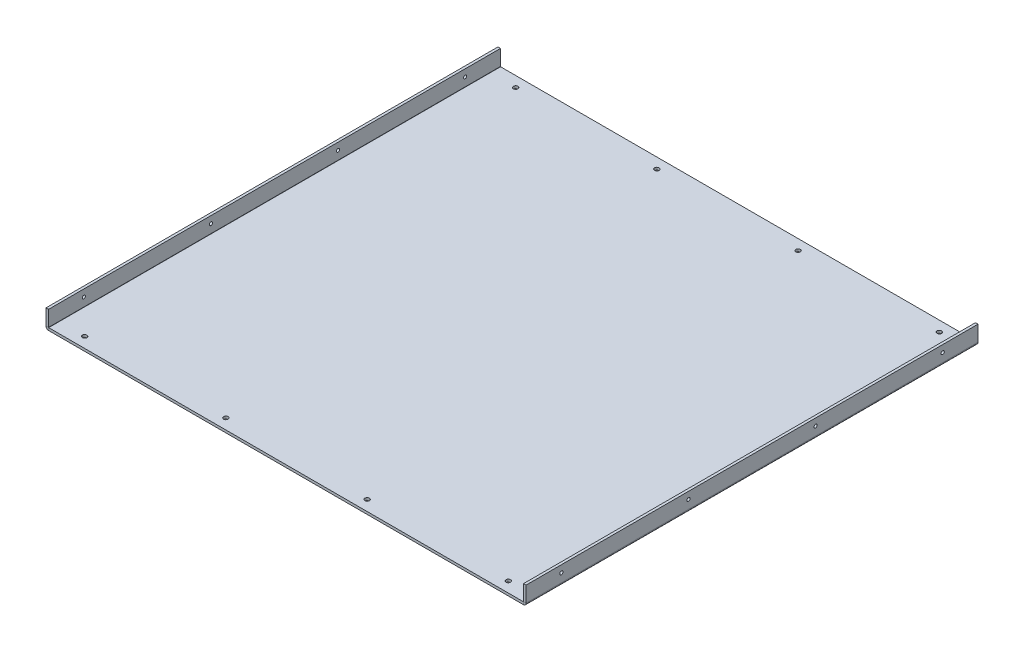
ISO-10303-21;
HEADER;
FILE_DESCRIPTION(('STEP AP214'),'2;1');
FILE_NAME('part.step','',(''),(''),'','','');
FILE_SCHEMA(('AUTOMOTIVE_DESIGN { 1 0 10303 214 1 1 1 1 }'));
ENDSEC;
DATA;
#1=APPLICATION_CONTEXT('core data for automotive mechanical design processes');
#2=APPLICATION_PROTOCOL_DEFINITION('international standard','automotive_design',2000,#1);
#3=PRODUCT_CONTEXT('',#1,'mechanical');
#4=PRODUCT('Part','Part','',(#3));
#5=PRODUCT_RELATED_PRODUCT_CATEGORY('part','',(#4));
#6=PRODUCT_DEFINITION_FORMATION('','',#4);
#7=PRODUCT_DEFINITION_CONTEXT('part definition',#1,'design');
#8=PRODUCT_DEFINITION('design','',#6,#7);
#9=PRODUCT_DEFINITION_SHAPE('','',#8);
#10=(LENGTH_UNIT() NAMED_UNIT(*) SI_UNIT(.MILLI.,.METRE.));
#11=(NAMED_UNIT(*) PLANE_ANGLE_UNIT() SI_UNIT($,.RADIAN.));
#12=(NAMED_UNIT(*) SI_UNIT($,.STERADIAN.) SOLID_ANGLE_UNIT());
#13=UNCERTAINTY_MEASURE_WITH_UNIT(LENGTH_MEASURE(1.E-05),#10,'distance_accuracy_value','');
#14=(GEOMETRIC_REPRESENTATION_CONTEXT(3) GLOBAL_UNCERTAINTY_ASSIGNED_CONTEXT((#13)) GLOBAL_UNIT_ASSIGNED_CONTEXT((#10,
#11,#12)) REPRESENTATION_CONTEXT('',''));
#15=CARTESIAN_POINT('',(0.,0.,0.));
#16=DIRECTION('',(0.,0.,1.));
#17=DIRECTION('',(1.,0.,0.));
#18=AXIS2_PLACEMENT_3D('',#15,#16,#17);
#19=CARTESIAN_POINT('',(0.,2.4384,406.4));
#20=DIRECTION('',(0.,0.,1.));
#21=DIRECTION('',(1.,0.,0.));
#22=AXIS2_PLACEMENT_3D('',#19,#20,#21);
#23=PLANE('',#22);
#24=DIRECTION('',(1.,0.,0.));
#25=VECTOR('',#24,1.);
#26=CARTESIAN_POINT('',(0.,2.4384,406.4));
#27=LINE('',#26,#25);
#28=CARTESIAN_POINT('',(0.,2.4384,406.4));
#29=VERTEX_POINT('',#28);
#30=CARTESIAN_POINT('',(2.286,2.4384,406.4));
#31=VERTEX_POINT('',#30);
#32=EDGE_CURVE('E11',#29,#31,#27,.T.);
#33=ORIENTED_EDGE('',*,*,#32,.F.);
#34=CARTESIAN_POINT('',(2.4384,2.4384,406.4));
#35=DIRECTION('',(0.,0.,-1.));
#36=DIRECTION('',(-1.,0.,0.));
#37=AXIS2_PLACEMENT_3D('',#34,#35,#36);
#38=CIRCLE('',#37,2.4384);
#39=CARTESIAN_POINT('',(2.4384,0.,406.4));
#40=VERTEX_POINT('',#39);
#41=EDGE_CURVE('E147',#29,#40,#38,.F.);
#42=ORIENTED_EDGE('',*,*,#41,.T.);
#43=DIRECTION('',(0.,-1.,0.));
#44=VECTOR('',#43,1.);
#45=CARTESIAN_POINT('',(2.4384,2.286,406.4));
#46=LINE('',#45,#44);
#47=CARTESIAN_POINT('',(2.4384,2.286,406.4));
#48=VERTEX_POINT('',#47);
#49=EDGE_CURVE('E45',#48,#40,#46,.T.);
#50=ORIENTED_EDGE('',*,*,#49,.F.);
#51=CARTESIAN_POINT('',(2.4384,2.4384,406.4));
#52=DIRECTION('',(0.,0.,1.));
#53=DIRECTION('',(1.,0.,0.));
#54=AXIS2_PLACEMENT_3D('',#51,#52,#53);
#55=CIRCLE('',#54,0.1524);
#56=EDGE_CURVE('E242',#31,#48,#55,.T.);
#57=ORIENTED_EDGE('',*,*,#56,.F.);
#58=EDGE_LOOP('',(#33,#42,#50,#57));
#59=FACE_BOUND('',#58,.T.);
#60=ADVANCED_FACE('F37',(#59),#23,.T.);
#61=CARTESIAN_POINT('',(2.4384,2.286,406.4));
#62=DIRECTION('',(0.,0.,1.));
#63=DIRECTION('',(1.,0.,0.));
#64=AXIS2_PLACEMENT_3D('',#61,#62,#63);
#65=PLANE('',#64);
#66=DIRECTION('',(0.,-1.,0.));
#67=VECTOR('',#66,1.);
#68=CARTESIAN_POINT('',(0.,0.,406.4));
#69=LINE('',#68,#67);
#70=CARTESIAN_POINT('',(0.,16.51,406.4));
#71=VERTEX_POINT('',#70);
#72=EDGE_CURVE('E152',#71,#29,#69,.T.);
#73=ORIENTED_EDGE('',*,*,#72,.T.);
#74=ORIENTED_EDGE('',*,*,#32,.T.);
#75=DIRECTION('',(0.,1.,0.));
#76=VECTOR('',#75,1.);
#77=CARTESIAN_POINT('',(2.286,0.,406.4));
#78=LINE('',#77,#76);
#79=CARTESIAN_POINT('',(2.286,16.51,406.4));
#80=VERTEX_POINT('',#79);
#81=EDGE_CURVE('E255',#80,#31,#78,.F.);
#82=ORIENTED_EDGE('',*,*,#81,.F.);
#83=DIRECTION('',(1.,0.,0.));
#84=VECTOR('',#83,1.);
#85=CARTESIAN_POINT('',(0.,16.51,406.4));
#86=LINE('',#85,#84);
#87=EDGE_CURVE('E257',#71,#80,#86,.T.);
#88=ORIENTED_EDGE('',*,*,#87,.F.);
#89=EDGE_LOOP('',(#73,#74,#82,#88));
#90=FACE_BOUND('',#89,.T.);
#91=ADVANCED_FACE('F268',(#90),#65,.T.);
#92=CARTESIAN_POINT('',(2.4384,0.,0.));
#93=DIRECTION('',(0.,0.,-1.));
#94=DIRECTION('',(-1.,0.,0.));
#95=AXIS2_PLACEMENT_3D('',#92,#93,#94);
#96=PLANE('',#95);
#97=DIRECTION('',(0.,1.,0.));
#98=VECTOR('',#97,1.);
#99=CARTESIAN_POINT('',(2.4384,0.,0.));
#100=LINE('',#99,#98);
#101=CARTESIAN_POINT('',(2.4384,0.,0.));
#102=VERTEX_POINT('',#101);
#103=CARTESIAN_POINT('',(2.4384,2.286,0.));
#104=VERTEX_POINT('',#103);
#105=EDGE_CURVE('E145',#102,#104,#100,.T.);
#106=ORIENTED_EDGE('',*,*,#105,.F.);
#107=CARTESIAN_POINT('',(2.4384,2.4384,0.));
#108=DIRECTION('',(0.,0.,-1.));
#109=DIRECTION('',(-1.,0.,0.));
#110=AXIS2_PLACEMENT_3D('',#107,#108,#109);
#111=CIRCLE('',#110,2.4384);
#112=CARTESIAN_POINT('',(0.,2.4384,0.));
#113=VERTEX_POINT('',#112);
#114=EDGE_CURVE('E159',#113,#102,#111,.F.);
#115=ORIENTED_EDGE('',*,*,#114,.F.);
#116=DIRECTION('',(-1.,0.,0.));
#117=VECTOR('',#116,1.);
#118=CARTESIAN_POINT('',(2.286,2.4384,0.));
#119=LINE('',#118,#117);
#120=CARTESIAN_POINT('',(2.286,2.4384,0.));
#121=VERTEX_POINT('',#120);
#122=EDGE_CURVE('E233',#121,#113,#119,.T.);
#123=ORIENTED_EDGE('',*,*,#122,.F.);
#124=CARTESIAN_POINT('',(2.4384,2.4384,0.));
#125=DIRECTION('',(0.,0.,1.));
#126=DIRECTION('',(1.,0.,0.));
#127=AXIS2_PLACEMENT_3D('',#124,#125,#126);
#128=CIRCLE('',#127,0.1524);
#129=EDGE_CURVE('E187',#121,#104,#128,.T.);
#130=ORIENTED_EDGE('',*,*,#129,.T.);
#131=EDGE_LOOP('',(#106,#115,#123,#130));
#132=FACE_BOUND('',#131,.T.);
#133=ADVANCED_FACE('F247',(#132),#96,.T.);
#134=CARTESIAN_POINT('',(2.286,2.4384,0.));
#135=DIRECTION('',(0.,0.,-1.));
#136=DIRECTION('',(-1.,0.,0.));
#137=AXIS2_PLACEMENT_3D('',#134,#135,#136);
#138=PLANE('',#137);
#139=DIRECTION('',(1.,0.,0.));
#140=VECTOR('',#139,1.);
#141=CARTESIAN_POINT('',(0.,0.,0.));
#142=LINE('',#141,#140);
#143=CARTESIAN_POINT('',(429.3616,0.,0.));
#144=VERTEX_POINT('',#143);
#145=EDGE_CURVE('E200',#102,#144,#142,.T.);
#146=ORIENTED_EDGE('',*,*,#145,.F.);
#147=ORIENTED_EDGE('',*,*,#105,.T.);
#148=DIRECTION('',(1.,0.,0.));
#149=VECTOR('',#148,1.);
#150=CARTESIAN_POINT('',(0.,2.286,0.));
#151=LINE('',#150,#149);
#152=CARTESIAN_POINT('',(429.3616,2.286,0.));
#153=VERTEX_POINT('',#152);
#154=EDGE_CURVE('E185',#104,#153,#151,.T.);
#155=ORIENTED_EDGE('',*,*,#154,.T.);
#156=DIRECTION('',(0.,-1.,0.));
#157=VECTOR('',#156,1.);
#158=CARTESIAN_POINT('',(429.3616,2.286,0.));
#159=LINE('',#158,#157);
#160=EDGE_CURVE('E94',#153,#144,#159,.T.);
#161=ORIENTED_EDGE('',*,*,#160,.T.);
#162=EDGE_LOOP('',(#146,#147,#155,#161));
#163=FACE_BOUND('',#162,.T.);
#164=ADVANCED_FACE('F235',(#163),#138,.T.);
#165=CARTESIAN_POINT('',(429.3616,0.,406.4));
#166=DIRECTION('',(0.,0.,1.));
#167=DIRECTION('',(1.,0.,0.));
#168=AXIS2_PLACEMENT_3D('',#165,#166,#167);
#169=PLANE('',#168);
#170=DIRECTION('',(0.,1.,0.));
#171=VECTOR('',#170,1.);
#172=CARTESIAN_POINT('',(429.3616,0.,406.4));
#173=LINE('',#172,#171);
#174=CARTESIAN_POINT('',(429.3616,0.,406.4));
#175=VERTEX_POINT('',#174);
#176=CARTESIAN_POINT('',(429.3616,2.286,406.4));
#177=VERTEX_POINT('',#176);
#178=EDGE_CURVE('E231',#175,#177,#173,.T.);
#179=ORIENTED_EDGE('',*,*,#178,.F.);
#180=CARTESIAN_POINT('',(429.3616,2.4384,406.4));
#181=DIRECTION('',(0.,0.,-1.));
#182=DIRECTION('',(-1.,0.,0.));
#183=AXIS2_PLACEMENT_3D('',#180,#181,#182);
#184=CIRCLE('',#183,2.4384);
#185=CARTESIAN_POINT('',(431.8,2.4384,406.4));
#186=VERTEX_POINT('',#185);
#187=EDGE_CURVE('E167',#175,#186,#184,.F.);
#188=ORIENTED_EDGE('',*,*,#187,.T.);
#189=DIRECTION('',(1.,0.,0.));
#190=VECTOR('',#189,1.);
#191=CARTESIAN_POINT('',(429.514,2.4384,406.4));
#192=LINE('',#191,#190);
#193=CARTESIAN_POINT('',(429.514,2.4384,406.4));
#194=VERTEX_POINT('',#193);
#195=EDGE_CURVE('E53',#194,#186,#192,.T.);
#196=ORIENTED_EDGE('',*,*,#195,.F.);
#197=CARTESIAN_POINT('',(429.3616,2.4384,406.4));
#198=DIRECTION('',(0.,0.,1.));
#199=DIRECTION('',(1.,0.,0.));
#200=AXIS2_PLACEMENT_3D('',#197,#198,#199);
#201=CIRCLE('',#200,0.1524);
#202=EDGE_CURVE('E259',#177,#194,#201,.T.);
#203=ORIENTED_EDGE('',*,*,#202,.F.);
#204=EDGE_LOOP('',(#179,#188,#196,#203));
#205=FACE_BOUND('',#204,.T.);
#206=ADVANCED_FACE('F296',(#205),#169,.T.);
#207=CARTESIAN_POINT('',(429.514,2.4384,406.4));
#208=DIRECTION('',(0.,0.,1.));
#209=DIRECTION('',(1.,0.,0.));
#210=AXIS2_PLACEMENT_3D('',#207,#208,#209);
#211=PLANE('',#210);
#212=DIRECTION('',(1.,0.,0.));
#213=VECTOR('',#212,1.);
#214=CARTESIAN_POINT('',(0.,0.,406.4));
#215=LINE('',#214,#213);
#216=EDGE_CURVE('E137',#40,#175,#215,.T.);
#217=ORIENTED_EDGE('',*,*,#216,.T.);
#218=ORIENTED_EDGE('',*,*,#178,.T.);
#219=DIRECTION('',(1.,0.,0.));
#220=VECTOR('',#219,1.);
#221=CARTESIAN_POINT('',(0.,2.286,406.4));
#222=LINE('',#221,#220);
#223=EDGE_CURVE('E140',#48,#177,#222,.T.);
#224=ORIENTED_EDGE('',*,*,#223,.F.);
#225=ORIENTED_EDGE('',*,*,#49,.T.);
#226=EDGE_LOOP('',(#217,#218,#224,#225));
#227=FACE_BOUND('',#226,.T.);
#228=ADVANCED_FACE('F135',(#227),#211,.T.);
#229=CARTESIAN_POINT('',(431.8,2.4384,0.));
#230=DIRECTION('',(0.,0.,-1.));
#231=DIRECTION('',(-1.,0.,0.));
#232=AXIS2_PLACEMENT_3D('',#229,#230,#231);
#233=PLANE('',#232);
#234=DIRECTION('',(-1.,0.,0.));
#235=VECTOR('',#234,1.);
#236=CARTESIAN_POINT('',(431.8,2.4384,0.));
#237=LINE('',#236,#235);
#238=CARTESIAN_POINT('',(431.8,2.4384,0.));
#239=VERTEX_POINT('',#238);
#240=CARTESIAN_POINT('',(429.514,2.4384,0.));
#241=VERTEX_POINT('',#240);
#242=EDGE_CURVE('E101',#239,#241,#237,.T.);
#243=ORIENTED_EDGE('',*,*,#242,.F.);
#244=CARTESIAN_POINT('',(429.3616,2.4384,0.));
#245=DIRECTION('',(0.,0.,-1.));
#246=DIRECTION('',(-1.,0.,0.));
#247=AXIS2_PLACEMENT_3D('',#244,#245,#246);
#248=CIRCLE('',#247,2.4384);
#249=EDGE_CURVE('E202',#144,#239,#248,.F.);
#250=ORIENTED_EDGE('',*,*,#249,.F.);
#251=ORIENTED_EDGE('',*,*,#160,.F.);
#252=CARTESIAN_POINT('',(429.3616,2.4384,0.));
#253=DIRECTION('',(0.,0.,1.));
#254=DIRECTION('',(1.,0.,0.));
#255=AXIS2_PLACEMENT_3D('',#252,#253,#254);
#256=CIRCLE('',#255,0.1524);
#257=EDGE_CURVE('E183',#153,#241,#256,.T.);
#258=ORIENTED_EDGE('',*,*,#257,.T.);
#259=EDGE_LOOP('',(#243,#250,#251,#258));
#260=FACE_BOUND('',#259,.T.);
#261=ADVANCED_FACE('F302',(#260),#233,.T.);
#262=CARTESIAN_POINT('',(429.3616,2.286,0.));
#263=DIRECTION('',(0.,0.,-1.));
#264=DIRECTION('',(-1.,0.,0.));
#265=AXIS2_PLACEMENT_3D('',#262,#263,#264);
#266=PLANE('',#265);
#267=DIRECTION('',(0.,1.,0.));
#268=VECTOR('',#267,1.);
#269=CARTESIAN_POINT('',(431.8,0.,0.));
#270=LINE('',#269,#268);
#271=CARTESIAN_POINT('',(431.8,16.51,0.));
#272=VERTEX_POINT('',#271);
#273=EDGE_CURVE('E173',#239,#272,#270,.T.);
#274=ORIENTED_EDGE('',*,*,#273,.F.);
#275=ORIENTED_EDGE('',*,*,#242,.T.);
#276=DIRECTION('',(0.,1.,0.));
#277=VECTOR('',#276,1.);
#278=CARTESIAN_POINT('',(429.514,0.,0.));
#279=LINE('',#278,#277);
#280=CARTESIAN_POINT('',(429.514,16.51,0.));
#281=VERTEX_POINT('',#280);
#282=EDGE_CURVE('E180',#241,#281,#279,.T.);
#283=ORIENTED_EDGE('',*,*,#282,.T.);
#284=DIRECTION('',(1.,0.,0.));
#285=VECTOR('',#284,1.);
#286=CARTESIAN_POINT('',(429.514,16.51,0.));
#287=LINE('',#286,#285);
#288=EDGE_CURVE('E176',#281,#272,#287,.T.);
#289=ORIENTED_EDGE('',*,*,#288,.T.);
#290=EDGE_LOOP('',(#274,#275,#283,#289));
#291=FACE_BOUND('',#290,.T.);
#292=ADVANCED_FACE('F305',(#291),#266,.T.);
#293=CARTESIAN_POINT('',(431.8,0.,406.4));
#294=DIRECTION('',(-1.,0.,0.));
#295=DIRECTION('',(0.,0.,1.));
#296=AXIS2_PLACEMENT_3D('',#293,#294,#295);
#297=PLANE('',#296);
#298=CARTESIAN_POINT('',(431.8,10.1599999999976,374.65));
#299=DIRECTION('',(1.,0.,0.));
#300=DIRECTION('',(0.,0.,-1.));
#301=AXIS2_PLACEMENT_3D('',#298,#299,#300);
#302=CIRCLE('',#301,1.4478);
#303=CARTESIAN_POINT('',(431.8,10.1599999999976,373.2022));
#304=VERTEX_POINT('',#303);
#305=EDGE_CURVE('E760',#304,#304,#302,.T.);
#306=ORIENTED_EDGE('',*,*,#305,.F.);
#307=EDGE_LOOP('',(#306));
#308=FACE_BOUND('',#307,.T.);
#309=CARTESIAN_POINT('',(431.8,10.1599999999984,260.35));
#310=DIRECTION('',(1.,0.,0.));
#311=DIRECTION('',(0.,0.,-1.));
#312=AXIS2_PLACEMENT_3D('',#309,#310,#311);
#313=CIRCLE('',#312,1.4478);
#314=CARTESIAN_POINT('',(431.8,10.1599999999984,258.9022));
#315=VERTEX_POINT('',#314);
#316=EDGE_CURVE('E748',#315,#315,#313,.T.);
#317=ORIENTED_EDGE('',*,*,#316,.F.);
#318=EDGE_LOOP('',(#317));
#319=FACE_BOUND('',#318,.T.);
#320=CARTESIAN_POINT('',(431.8,10.1599999999992,146.05));
#321=DIRECTION('',(1.,0.,0.));
#322=DIRECTION('',(0.,0.,-1.));
#323=AXIS2_PLACEMENT_3D('',#320,#321,#322);
#324=CIRCLE('',#323,1.4478);
#325=CARTESIAN_POINT('',(431.8,10.1599999999992,144.6022));
#326=VERTEX_POINT('',#325);
#327=EDGE_CURVE('E736',#326,#326,#324,.T.);
#328=ORIENTED_EDGE('',*,*,#327,.F.);
#329=EDGE_LOOP('',(#328));
#330=FACE_BOUND('',#329,.T.);
#331=CARTESIAN_POINT('',(431.8,10.16,31.75));
#332=DIRECTION('',(1.,0.,0.));
#333=DIRECTION('',(0.,0.,-1.));
#334=AXIS2_PLACEMENT_3D('',#331,#332,#333);
#335=CIRCLE('',#334,1.4478);
#336=CARTESIAN_POINT('',(431.8,10.16,30.3022));
#337=VERTEX_POINT('',#336);
#338=EDGE_CURVE('E724',#337,#337,#335,.T.);
#339=ORIENTED_EDGE('',*,*,#338,.F.);
#340=EDGE_LOOP('',(#339));
#341=FACE_BOUND('',#340,.T.);
#342=ORIENTED_EDGE('',*,*,#273,.T.);
#343=DIRECTION('',(0.,0.,-1.));
#344=VECTOR('',#343,1.);
#345=CARTESIAN_POINT('',(431.8,16.51,406.4));
#346=LINE('',#345,#344);
#347=CARTESIAN_POINT('',(431.8,16.51,406.4));
#348=VERTEX_POINT('',#347);
#349=EDGE_CURVE('E226',#348,#272,#346,.T.);
#350=ORIENTED_EDGE('',*,*,#349,.F.);
#351=DIRECTION('',(0.,1.,0.));
#352=VECTOR('',#351,1.);
#353=CARTESIAN_POINT('',(431.8,0.,406.4));
#354=LINE('',#353,#352);
#355=EDGE_CURVE('E107',#186,#348,#354,.T.);
#356=ORIENTED_EDGE('',*,*,#355,.F.);
#357=DIRECTION('',(0.,0.,-1.));
#358=VECTOR('',#357,1.);
#359=CARTESIAN_POINT('',(431.8,2.4384,406.4));
#360=LINE('',#359,#358);
#361=EDGE_CURVE('E169',#186,#239,#360,.T.);
#362=ORIENTED_EDGE('',*,*,#361,.T.);
#363=EDGE_LOOP('',(#342,#350,#356,#362));
#364=FACE_BOUND('',#363,.T.);
#365=ADVANCED_FACE('F308',(#308,#319,#330,#341,#364),#297,.F.);
#366=CARTESIAN_POINT('',(429.514,16.51,406.4));
#367=DIRECTION('',(0.,1.,0.));
#368=DIRECTION('',(0.,0.,1.));
#369=AXIS2_PLACEMENT_3D('',#366,#367,#368);
#370=PLANE('',#369);
#371=ORIENTED_EDGE('',*,*,#288,.F.);
#372=DIRECTION('',(0.,0.,-1.));
#373=VECTOR('',#372,1.);
#374=CARTESIAN_POINT('',(429.514,16.51,406.4));
#375=LINE('',#374,#373);
#376=CARTESIAN_POINT('',(429.514,16.51,406.4));
#377=VERTEX_POINT('',#376);
#378=EDGE_CURVE('E224',#377,#281,#375,.T.);
#379=ORIENTED_EDGE('',*,*,#378,.F.);
#380=DIRECTION('',(1.,0.,0.));
#381=VECTOR('',#380,1.);
#382=CARTESIAN_POINT('',(429.514,16.51,406.4));
#383=LINE('',#382,#381);
#384=EDGE_CURVE('E707',#377,#348,#383,.T.);
#385=ORIENTED_EDGE('',*,*,#384,.T.);
#386=ORIENTED_EDGE('',*,*,#349,.T.);
#387=EDGE_LOOP('',(#371,#379,#385,#386));
#388=FACE_BOUND('',#387,.T.);
#389=ADVANCED_FACE('F312',(#388),#370,.T.);
#390=CARTESIAN_POINT('',(429.514,0.,406.4));
#391=DIRECTION('',(-1.,0.,0.));
#392=DIRECTION('',(0.,0.,1.));
#393=AXIS2_PLACEMENT_3D('',#390,#391,#392);
#394=PLANE('',#393);
#395=CARTESIAN_POINT('',(429.514,10.1599999999976,374.65));
#396=DIRECTION('',(-1.,0.,0.));
#397=DIRECTION('',(0.,0.,1.));
#398=AXIS2_PLACEMENT_3D('',#395,#396,#397);
#399=CIRCLE('',#398,1.4478);
#400=CARTESIAN_POINT('',(429.514,10.1599999999976,376.0978));
#401=VERTEX_POINT('',#400);
#402=EDGE_CURVE('E751',#401,#401,#399,.T.);
#403=ORIENTED_EDGE('',*,*,#402,.F.);
#404=EDGE_LOOP('',(#403));
#405=FACE_BOUND('',#404,.T.);
#406=CARTESIAN_POINT('',(429.514,10.1599999999984,260.35));
#407=DIRECTION('',(-1.,0.,0.));
#408=DIRECTION('',(0.,0.,1.));
#409=AXIS2_PLACEMENT_3D('',#406,#407,#408);
#410=CIRCLE('',#409,1.4478);
#411=CARTESIAN_POINT('',(429.514,10.1599999999984,261.7978));
#412=VERTEX_POINT('',#411);
#413=EDGE_CURVE('E739',#412,#412,#410,.T.);
#414=ORIENTED_EDGE('',*,*,#413,.F.);
#415=EDGE_LOOP('',(#414));
#416=FACE_BOUND('',#415,.T.);
#417=CARTESIAN_POINT('',(429.514,10.1599999999992,146.05));
#418=DIRECTION('',(-1.,0.,0.));
#419=DIRECTION('',(0.,0.,1.));
#420=AXIS2_PLACEMENT_3D('',#417,#418,#419);
#421=CIRCLE('',#420,1.4478);
#422=CARTESIAN_POINT('',(429.514,10.1599999999992,147.4978));
#423=VERTEX_POINT('',#422);
#424=EDGE_CURVE('E727',#423,#423,#421,.T.);
#425=ORIENTED_EDGE('',*,*,#424,.F.);
#426=EDGE_LOOP('',(#425));
#427=FACE_BOUND('',#426,.T.);
#428=CARTESIAN_POINT('',(429.514,10.16,31.75));
#429=DIRECTION('',(-1.,0.,0.));
#430=DIRECTION('',(0.,0.,1.));
#431=AXIS2_PLACEMENT_3D('',#428,#429,#430);
#432=CIRCLE('',#431,1.4478);
#433=CARTESIAN_POINT('',(429.514,10.16,33.1978));
#434=VERTEX_POINT('',#433);
#435=EDGE_CURVE('E177',#434,#434,#432,.T.);
#436=ORIENTED_EDGE('',*,*,#435,.F.);
#437=EDGE_LOOP('',(#436));
#438=FACE_BOUND('',#437,.T.);
#439=ORIENTED_EDGE('',*,*,#282,.F.);
#440=DIRECTION('',(0.,0.,-1.));
#441=VECTOR('',#440,1.);
#442=CARTESIAN_POINT('',(429.514,2.4384,406.4));
#443=LINE('',#442,#441);
#444=EDGE_CURVE('E221',#194,#241,#443,.T.);
#445=ORIENTED_EDGE('',*,*,#444,.F.);
#446=DIRECTION('',(0.,1.,0.));
#447=VECTOR('',#446,1.);
#448=CARTESIAN_POINT('',(429.514,0.,406.4));
#449=LINE('',#448,#447);
#450=EDGE_CURVE('E709',#194,#377,#449,.T.);
#451=ORIENTED_EDGE('',*,*,#450,.T.);
#452=ORIENTED_EDGE('',*,*,#378,.T.);
#453=EDGE_LOOP('',(#439,#445,#451,#452));
#454=FACE_BOUND('',#453,.T.);
#455=ADVANCED_FACE('F316',(#405,#416,#427,#438,#454),#394,.T.);
#456=CARTESIAN_POINT('',(429.3616,2.4384,406.4));
#457=DIRECTION('',(0.,0.,-1.));
#458=DIRECTION('',(-1.,0.,0.));
#459=AXIS2_PLACEMENT_3D('',#456,#457,#458);
#460=CYLINDRICAL_SURFACE('',#459,0.1524);
#461=ORIENTED_EDGE('',*,*,#257,.F.);
#462=DIRECTION('',(0.,0.,-1.));
#463=VECTOR('',#462,1.);
#464=CARTESIAN_POINT('',(429.3616,2.286,406.4));
#465=LINE('',#464,#463);
#466=EDGE_CURVE('E218',#177,#153,#465,.T.);
#467=ORIENTED_EDGE('',*,*,#466,.F.);
#468=ORIENTED_EDGE('',*,*,#202,.T.);
#469=ORIENTED_EDGE('',*,*,#444,.T.);
#470=EDGE_LOOP('',(#461,#467,#468,#469));
#471=FACE_BOUND('',#470,.T.);
#472=ADVANCED_FACE('F320',(#471),#460,.F.);
#473=CARTESIAN_POINT('',(0.,2.286,406.4));
#474=DIRECTION('',(0.,1.,0.));
#475=DIRECTION('',(0.,0.,1.));
#476=AXIS2_PLACEMENT_3D('',#473,#474,#475);
#477=PLANE('',#476);
#478=CARTESIAN_POINT('',(25.3999999999959,2.286,9.39799999999996));
#479=DIRECTION('',(0.,1.,0.));
#480=DIRECTION('',(0.,0.,1.));
#481=AXIS2_PLACEMENT_3D('',#478,#479,#480);
#482=CIRCLE('',#481,2.03199999999993);
#483=CARTESIAN_POINT('',(25.3999999999959,2.286,11.4299999999999));
#484=VERTEX_POINT('',#483);
#485=EDGE_CURVE('E808',#484,#484,#482,.T.);
#486=ORIENTED_EDGE('',*,*,#485,.F.);
#487=EDGE_LOOP('',(#486));
#488=FACE_BOUND('',#487,.T.);
#489=CARTESIAN_POINT('',(152.399999999996,2.286,9.39799999999996));
#490=DIRECTION('',(0.,1.,0.));
#491=DIRECTION('',(0.,0.,1.));
#492=AXIS2_PLACEMENT_3D('',#489,#490,#491);
#493=CIRCLE('',#492,2.03199999999995);
#494=CARTESIAN_POINT('',(152.399999999996,2.286,11.4299999999999));
#495=VERTEX_POINT('',#494);
#496=EDGE_CURVE('E802',#495,#495,#493,.T.);
#497=ORIENTED_EDGE('',*,*,#496,.F.);
#498=EDGE_LOOP('',(#497));
#499=FACE_BOUND('',#498,.T.);
#500=CARTESIAN_POINT('',(279.399999999996,2.286,9.39799999999996));
#501=DIRECTION('',(0.,1.,0.));
#502=DIRECTION('',(0.,0.,1.));
#503=AXIS2_PLACEMENT_3D('',#500,#501,#502);
#504=CIRCLE('',#503,2.03199999999995);
#505=CARTESIAN_POINT('',(279.399999999996,2.286,11.4299999999999));
#506=VERTEX_POINT('',#505);
#507=EDGE_CURVE('E796',#506,#506,#504,.T.);
#508=ORIENTED_EDGE('',*,*,#507,.F.);
#509=EDGE_LOOP('',(#508));
#510=FACE_BOUND('',#509,.T.);
#511=CARTESIAN_POINT('',(406.399999999996,2.286,9.39799999999996));
#512=DIRECTION('',(0.,1.,0.));
#513=DIRECTION('',(0.,0.,1.));
#514=AXIS2_PLACEMENT_3D('',#511,#512,#513);
#515=CIRCLE('',#514,2.03199999999995);
#516=CARTESIAN_POINT('',(406.399999999996,2.286,11.4299999999999));
#517=VERTEX_POINT('',#516);
#518=EDGE_CURVE('E790',#517,#517,#515,.T.);
#519=ORIENTED_EDGE('',*,*,#518,.F.);
#520=EDGE_LOOP('',(#519));
#521=FACE_BOUND('',#520,.T.);
#522=CARTESIAN_POINT('',(25.4,2.286,397.002));
#523=DIRECTION('',(0.,1.,0.));
#524=DIRECTION('',(0.,0.,1.));
#525=AXIS2_PLACEMENT_3D('',#522,#523,#524);
#526=CIRCLE('',#525,2.03199999999992);
#527=CARTESIAN_POINT('',(25.4,2.286,399.034));
#528=VERTEX_POINT('',#527);
#529=EDGE_CURVE('E784',#528,#528,#526,.T.);
#530=ORIENTED_EDGE('',*,*,#529,.F.);
#531=EDGE_LOOP('',(#530));
#532=FACE_BOUND('',#531,.T.);
#533=CARTESIAN_POINT('',(152.4,2.286,397.002));
#534=DIRECTION('',(0.,1.,0.));
#535=DIRECTION('',(0.,0.,1.));
#536=AXIS2_PLACEMENT_3D('',#533,#534,#535);
#537=CIRCLE('',#536,2.03199999999994);
#538=CARTESIAN_POINT('',(152.4,2.286,399.034));
#539=VERTEX_POINT('',#538);
#540=EDGE_CURVE('E778',#539,#539,#537,.T.);
#541=ORIENTED_EDGE('',*,*,#540,.F.);
#542=EDGE_LOOP('',(#541));
#543=FACE_BOUND('',#542,.T.);
#544=CARTESIAN_POINT('',(279.4,2.286,397.002));
#545=DIRECTION('',(0.,1.,0.));
#546=DIRECTION('',(0.,0.,1.));
#547=AXIS2_PLACEMENT_3D('',#544,#545,#546);
#548=CIRCLE('',#547,2.03199999999994);
#549=CARTESIAN_POINT('',(279.4,2.286,399.034));
#550=VERTEX_POINT('',#549);
#551=EDGE_CURVE('E772',#550,#550,#548,.T.);
#552=ORIENTED_EDGE('',*,*,#551,.F.);
#553=EDGE_LOOP('',(#552));
#554=FACE_BOUND('',#553,.T.);
#555=CARTESIAN_POINT('',(406.4,2.286,397.002));
#556=DIRECTION('',(0.,1.,0.));
#557=DIRECTION('',(0.,0.,1.));
#558=AXIS2_PLACEMENT_3D('',#555,#556,#557);
#559=CIRCLE('',#558,2.03199999999994);
#560=CARTESIAN_POINT('',(406.4,2.286,399.034));
#561=VERTEX_POINT('',#560);
#562=EDGE_CURVE('E766',#561,#561,#559,.T.);
#563=ORIENTED_EDGE('',*,*,#562,.F.);
#564=EDGE_LOOP('',(#563));
#565=FACE_BOUND('',#564,.T.);
#566=ORIENTED_EDGE('',*,*,#154,.F.);
#567=DIRECTION('',(0.,0.,-1.));
#568=VECTOR('',#567,1.);
#569=CARTESIAN_POINT('',(2.4384,2.286,406.4));
#570=LINE('',#569,#568);
#571=EDGE_CURVE('E215',#48,#104,#570,.T.);
#572=ORIENTED_EDGE('',*,*,#571,.F.);
#573=ORIENTED_EDGE('',*,*,#223,.T.);
#574=ORIENTED_EDGE('',*,*,#466,.T.);
#575=EDGE_LOOP('',(#566,#572,#573,#574));
#576=FACE_BOUND('',#575,.T.);
#577=ADVANCED_FACE('F244',(#488,#499,#510,#521,#532,#543,#554,#565,#576),#477,.T.);
#578=CARTESIAN_POINT('',(2.4384,2.4384,406.4));
#579=DIRECTION('',(0.,0.,-1.));
#580=DIRECTION('',(-1.,0.,0.));
#581=AXIS2_PLACEMENT_3D('',#578,#579,#580);
#582=CYLINDRICAL_SURFACE('',#581,0.1524);
#583=ORIENTED_EDGE('',*,*,#129,.F.);
#584=DIRECTION('',(0.,0.,-1.));
#585=VECTOR('',#584,1.);
#586=CARTESIAN_POINT('',(2.286,2.4384,406.4));
#587=LINE('',#586,#585);
#588=EDGE_CURVE('E212',#31,#121,#587,.T.);
#589=ORIENTED_EDGE('',*,*,#588,.F.);
#590=ORIENTED_EDGE('',*,*,#56,.T.);
#591=ORIENTED_EDGE('',*,*,#571,.T.);
#592=EDGE_LOOP('',(#583,#589,#590,#591));
#593=FACE_BOUND('',#592,.T.);
#594=ADVANCED_FACE('F240',(#593),#582,.F.);
#595=CARTESIAN_POINT('',(2.286,0.,406.4));
#596=DIRECTION('',(1.,0.,0.));
#597=DIRECTION('',(0.,0.,-1.));
#598=AXIS2_PLACEMENT_3D('',#595,#596,#597);
#599=PLANE('',#598);
#600=CARTESIAN_POINT('',(2.286,10.1599999999976,374.65));
#601=DIRECTION('',(1.,0.,0.));
#602=DIRECTION('',(0.,0.,-1.));
#603=AXIS2_PLACEMENT_3D('',#600,#601,#602);
#604=CIRCLE('',#603,1.4478);
#605=CARTESIAN_POINT('',(2.286,10.1599999999976,373.2022));
#606=VERTEX_POINT('',#605);
#607=EDGE_CURVE('E756',#606,#606,#604,.T.);
#608=ORIENTED_EDGE('',*,*,#607,.F.);
#609=EDGE_LOOP('',(#608));
#610=FACE_BOUND('',#609,.T.);
#611=CARTESIAN_POINT('',(2.286,10.1599999999984,260.35));
#612=DIRECTION('',(1.,0.,0.));
#613=DIRECTION('',(0.,0.,-1.));
#614=AXIS2_PLACEMENT_3D('',#611,#612,#613);
#615=CIRCLE('',#614,1.4478);
#616=CARTESIAN_POINT('',(2.286,10.1599999999984,258.9022));
#617=VERTEX_POINT('',#616);
#618=EDGE_CURVE('E744',#617,#617,#615,.T.);
#619=ORIENTED_EDGE('',*,*,#618,.F.);
#620=EDGE_LOOP('',(#619));
#621=FACE_BOUND('',#620,.T.);
#622=CARTESIAN_POINT('',(2.286,10.1599999999992,146.05));
#623=DIRECTION('',(1.,0.,0.));
#624=DIRECTION('',(0.,0.,-1.));
#625=AXIS2_PLACEMENT_3D('',#622,#623,#624);
#626=CIRCLE('',#625,1.4478);
#627=CARTESIAN_POINT('',(2.286,10.1599999999992,144.6022));
#628=VERTEX_POINT('',#627);
#629=EDGE_CURVE('E732',#628,#628,#626,.T.);
#630=ORIENTED_EDGE('',*,*,#629,.F.);
#631=EDGE_LOOP('',(#630));
#632=FACE_BOUND('',#631,.T.);
#633=CARTESIAN_POINT('',(2.286,10.16,31.75));
#634=DIRECTION('',(1.,0.,0.));
#635=DIRECTION('',(0.,0.,-1.));
#636=AXIS2_PLACEMENT_3D('',#633,#634,#635);
#637=CIRCLE('',#636,1.4478);
#638=CARTESIAN_POINT('',(2.286,10.16,30.3022));
#639=VERTEX_POINT('',#638);
#640=EDGE_CURVE('E720',#639,#639,#637,.T.);
#641=ORIENTED_EDGE('',*,*,#640,.F.);
#642=EDGE_LOOP('',(#641));
#643=FACE_BOUND('',#642,.T.);
#644=DIRECTION('',(0.,1.,0.));
#645=VECTOR('',#644,1.);
#646=CARTESIAN_POINT('',(2.286,0.,0.));
#647=LINE('',#646,#645);
#648=CARTESIAN_POINT('',(2.286,16.51,0.));
#649=VERTEX_POINT('',#648);
#650=EDGE_CURVE('E190',#649,#121,#647,.F.);
#651=ORIENTED_EDGE('',*,*,#650,.F.);
#652=DIRECTION('',(0.,0.,-1.));
#653=VECTOR('',#652,1.);
#654=CARTESIAN_POINT('',(2.286,16.51,406.4));
#655=LINE('',#654,#653);
#656=EDGE_CURVE('E210',#80,#649,#655,.T.);
#657=ORIENTED_EDGE('',*,*,#656,.F.);
#658=ORIENTED_EDGE('',*,*,#81,.T.);
#659=ORIENTED_EDGE('',*,*,#588,.T.);
#660=EDGE_LOOP('',(#651,#657,#658,#659));
#661=FACE_BOUND('',#660,.T.);
#662=ADVANCED_FACE('F253',(#610,#621,#632,#643,#661),#599,.T.);
#663=CARTESIAN_POINT('',(0.,16.51,406.4));
#664=DIRECTION('',(0.,1.,0.));
#665=DIRECTION('',(0.,0.,1.));
#666=AXIS2_PLACEMENT_3D('',#663,#664,#665);
#667=PLANE('',#666);
#668=DIRECTION('',(1.,0.,0.));
#669=VECTOR('',#668,1.);
#670=CARTESIAN_POINT('',(0.,16.51,0.));
#671=LINE('',#670,#669);
#672=CARTESIAN_POINT('',(0.,16.51,0.));
#673=VERTEX_POINT('',#672);
#674=EDGE_CURVE('E193',#673,#649,#671,.T.);
#675=ORIENTED_EDGE('',*,*,#674,.F.);
#676=DIRECTION('',(0.,0.,-1.));
#677=VECTOR('',#676,1.);
#678=CARTESIAN_POINT('',(0.,16.51,406.4));
#679=LINE('',#678,#677);
#680=EDGE_CURVE('E208',#71,#673,#679,.T.);
#681=ORIENTED_EDGE('',*,*,#680,.F.);
#682=ORIENTED_EDGE('',*,*,#87,.T.);
#683=ORIENTED_EDGE('',*,*,#656,.T.);
#684=EDGE_LOOP('',(#675,#681,#682,#683));
#685=FACE_BOUND('',#684,.T.);
#686=ADVANCED_FACE('F274',(#685),#667,.T.);
#687=CARTESIAN_POINT('',(0.,0.,406.4));
#688=DIRECTION('',(1.,0.,0.));
#689=DIRECTION('',(0.,0.,-1.));
#690=AXIS2_PLACEMENT_3D('',#687,#688,#689);
#691=PLANE('',#690);
#692=CARTESIAN_POINT('',(0.,10.1599999999976,374.65));
#693=DIRECTION('',(1.,0.,0.));
#694=DIRECTION('',(0.,0.,-1.));
#695=AXIS2_PLACEMENT_3D('',#692,#693,#694);
#696=CIRCLE('',#695,1.4478);
#697=CARTESIAN_POINT('',(0.,10.1599999999976,373.2022));
#698=VERTEX_POINT('',#697);
#699=EDGE_CURVE('E759',#698,#698,#696,.T.);
#700=ORIENTED_EDGE('',*,*,#699,.T.);
#701=EDGE_LOOP('',(#700));
#702=FACE_BOUND('',#701,.T.);
#703=CARTESIAN_POINT('',(0.,10.1599999999984,260.35));
#704=DIRECTION('',(1.,0.,0.));
#705=DIRECTION('',(0.,0.,-1.));
#706=AXIS2_PLACEMENT_3D('',#703,#704,#705);
#707=CIRCLE('',#706,1.4478);
#708=CARTESIAN_POINT('',(0.,10.1599999999984,258.9022));
#709=VERTEX_POINT('',#708);
#710=EDGE_CURVE('E747',#709,#709,#707,.T.);
#711=ORIENTED_EDGE('',*,*,#710,.T.);
#712=EDGE_LOOP('',(#711));
#713=FACE_BOUND('',#712,.T.);
#714=CARTESIAN_POINT('',(0.,10.1599999999992,146.05));
#715=DIRECTION('',(1.,0.,0.));
#716=DIRECTION('',(0.,0.,-1.));
#717=AXIS2_PLACEMENT_3D('',#714,#715,#716);
#718=CIRCLE('',#717,1.4478);
#719=CARTESIAN_POINT('',(0.,10.1599999999992,144.6022));
#720=VERTEX_POINT('',#719);
#721=EDGE_CURVE('E735',#720,#720,#718,.T.);
#722=ORIENTED_EDGE('',*,*,#721,.T.);
#723=EDGE_LOOP('',(#722));
#724=FACE_BOUND('',#723,.T.);
#725=CARTESIAN_POINT('',(0.,10.16,31.75));
#726=DIRECTION('',(1.,0.,0.));
#727=DIRECTION('',(0.,0.,-1.));
#728=AXIS2_PLACEMENT_3D('',#725,#726,#727);
#729=CIRCLE('',#728,1.4478);
#730=CARTESIAN_POINT('',(0.,10.16,30.3022));
#731=VERTEX_POINT('',#730);
#732=EDGE_CURVE('E723',#731,#731,#729,.T.);
#733=ORIENTED_EDGE('',*,*,#732,.T.);
#734=EDGE_LOOP('',(#733));
#735=FACE_BOUND('',#734,.T.);
#736=DIRECTION('',(0.,-1.,0.));
#737=VECTOR('',#736,1.);
#738=CARTESIAN_POINT('',(0.,0.,0.));
#739=LINE('',#738,#737);
#740=EDGE_CURVE('E196',#673,#113,#739,.T.);
#741=ORIENTED_EDGE('',*,*,#740,.T.);
#742=DIRECTION('',(0.,0.,-1.));
#743=VECTOR('',#742,1.);
#744=CARTESIAN_POINT('',(0.,2.4384,406.4));
#745=LINE('',#744,#743);
#746=EDGE_CURVE('E161',#29,#113,#745,.T.);
#747=ORIENTED_EDGE('',*,*,#746,.F.);
#748=ORIENTED_EDGE('',*,*,#72,.F.);
#749=ORIENTED_EDGE('',*,*,#680,.T.);
#750=EDGE_LOOP('',(#741,#747,#748,#749));
#751=FACE_BOUND('',#750,.T.);
#752=ADVANCED_FACE('F270',(#702,#713,#724,#735,#751),#691,.F.);
#753=CARTESIAN_POINT('',(2.4384,2.4384,406.4));
#754=DIRECTION('',(0.,0.,-1.));
#755=DIRECTION('',(-1.,0.,0.));
#756=AXIS2_PLACEMENT_3D('',#753,#754,#755);
#757=CYLINDRICAL_SURFACE('',#756,2.4384);
#758=ORIENTED_EDGE('',*,*,#114,.T.);
#759=DIRECTION('',(0.,0.,-1.));
#760=VECTOR('',#759,1.);
#761=CARTESIAN_POINT('',(2.4384,0.,406.4));
#762=LINE('',#761,#760);
#763=EDGE_CURVE('E156',#40,#102,#762,.T.);
#764=ORIENTED_EDGE('',*,*,#763,.F.);
#765=ORIENTED_EDGE('',*,*,#41,.F.);
#766=ORIENTED_EDGE('',*,*,#746,.T.);
#767=EDGE_LOOP('',(#758,#764,#765,#766));
#768=FACE_BOUND('',#767,.T.);
#769=ADVANCED_FACE('F157',(#768),#757,.T.);
#770=CARTESIAN_POINT('',(0.,0.,406.4));
#771=DIRECTION('',(0.,1.,0.));
#772=DIRECTION('',(0.,0.,1.));
#773=AXIS2_PLACEMENT_3D('',#770,#771,#772);
#774=PLANE('',#773);
#775=CARTESIAN_POINT('',(25.3999999999959,0.,9.39799999999996));
#776=DIRECTION('',(0.,1.,0.));
#777=DIRECTION('',(0.,0.,1.));
#778=AXIS2_PLACEMENT_3D('',#775,#776,#777);
#779=CIRCLE('',#778,2.03199999999993);
#780=CARTESIAN_POINT('',(25.3999999999959,0.,11.4299999999999));
#781=VERTEX_POINT('',#780);
#782=EDGE_CURVE('E805',#781,#781,#779,.T.);
#783=ORIENTED_EDGE('',*,*,#782,.T.);
#784=EDGE_LOOP('',(#783));
#785=FACE_BOUND('',#784,.T.);
#786=CARTESIAN_POINT('',(152.399999999996,0.,9.39799999999996));
#787=DIRECTION('',(0.,1.,0.));
#788=DIRECTION('',(0.,0.,1.));
#789=AXIS2_PLACEMENT_3D('',#786,#787,#788);
#790=CIRCLE('',#789,2.03199999999995);
#791=CARTESIAN_POINT('',(152.399999999996,0.,11.4299999999999));
#792=VERTEX_POINT('',#791);
#793=EDGE_CURVE('E799',#792,#792,#790,.T.);
#794=ORIENTED_EDGE('',*,*,#793,.T.);
#795=EDGE_LOOP('',(#794));
#796=FACE_BOUND('',#795,.T.);
#797=CARTESIAN_POINT('',(279.399999999996,0.,9.39799999999996));
#798=DIRECTION('',(0.,1.,0.));
#799=DIRECTION('',(0.,0.,1.));
#800=AXIS2_PLACEMENT_3D('',#797,#798,#799);
#801=CIRCLE('',#800,2.03199999999995);
#802=CARTESIAN_POINT('',(279.399999999996,0.,11.4299999999999));
#803=VERTEX_POINT('',#802);
#804=EDGE_CURVE('E793',#803,#803,#801,.T.);
#805=ORIENTED_EDGE('',*,*,#804,.T.);
#806=EDGE_LOOP('',(#805));
#807=FACE_BOUND('',#806,.T.);
#808=CARTESIAN_POINT('',(406.399999999996,0.,9.39799999999996));
#809=DIRECTION('',(0.,1.,0.));
#810=DIRECTION('',(0.,0.,1.));
#811=AXIS2_PLACEMENT_3D('',#808,#809,#810);
#812=CIRCLE('',#811,2.03199999999995);
#813=CARTESIAN_POINT('',(406.399999999996,0.,11.4299999999999));
#814=VERTEX_POINT('',#813);
#815=EDGE_CURVE('E787',#814,#814,#812,.T.);
#816=ORIENTED_EDGE('',*,*,#815,.T.);
#817=EDGE_LOOP('',(#816));
#818=FACE_BOUND('',#817,.T.);
#819=CARTESIAN_POINT('',(25.4,0.,397.002));
#820=DIRECTION('',(0.,1.,0.));
#821=DIRECTION('',(0.,0.,1.));
#822=AXIS2_PLACEMENT_3D('',#819,#820,#821);
#823=CIRCLE('',#822,2.03199999999992);
#824=CARTESIAN_POINT('',(25.4,0.,399.034));
#825=VERTEX_POINT('',#824);
#826=EDGE_CURVE('E781',#825,#825,#823,.T.);
#827=ORIENTED_EDGE('',*,*,#826,.T.);
#828=EDGE_LOOP('',(#827));
#829=FACE_BOUND('',#828,.T.);
#830=CARTESIAN_POINT('',(152.4,0.,397.002));
#831=DIRECTION('',(0.,1.,0.));
#832=DIRECTION('',(0.,0.,1.));
#833=AXIS2_PLACEMENT_3D('',#830,#831,#832);
#834=CIRCLE('',#833,2.03199999999994);
#835=CARTESIAN_POINT('',(152.4,0.,399.034));
#836=VERTEX_POINT('',#835);
#837=EDGE_CURVE('E775',#836,#836,#834,.T.);
#838=ORIENTED_EDGE('',*,*,#837,.T.);
#839=EDGE_LOOP('',(#838));
#840=FACE_BOUND('',#839,.T.);
#841=CARTESIAN_POINT('',(279.4,0.,397.002));
#842=DIRECTION('',(0.,1.,0.));
#843=DIRECTION('',(0.,0.,1.));
#844=AXIS2_PLACEMENT_3D('',#841,#842,#843);
#845=CIRCLE('',#844,2.03199999999994);
#846=CARTESIAN_POINT('',(279.4,0.,399.034));
#847=VERTEX_POINT('',#846);
#848=EDGE_CURVE('E769',#847,#847,#845,.T.);
#849=ORIENTED_EDGE('',*,*,#848,.T.);
#850=EDGE_LOOP('',(#849));
#851=FACE_BOUND('',#850,.T.);
#852=CARTESIAN_POINT('',(406.4,0.,397.002));
#853=DIRECTION('',(0.,1.,0.));
#854=DIRECTION('',(0.,0.,1.));
#855=AXIS2_PLACEMENT_3D('',#852,#853,#854);
#856=CIRCLE('',#855,2.03199999999994);
#857=CARTESIAN_POINT('',(406.4,0.,399.034));
#858=VERTEX_POINT('',#857);
#859=EDGE_CURVE('E763',#858,#858,#856,.T.);
#860=ORIENTED_EDGE('',*,*,#859,.T.);
#861=EDGE_LOOP('',(#860));
#862=FACE_BOUND('',#861,.T.);
#863=ORIENTED_EDGE('',*,*,#145,.T.);
#864=DIRECTION('',(0.,0.,-1.));
#865=VECTOR('',#864,1.);
#866=CARTESIAN_POINT('',(429.3616,0.,406.4));
#867=LINE('',#866,#865);
#868=EDGE_CURVE('E162',#175,#144,#867,.T.);
#869=ORIENTED_EDGE('',*,*,#868,.F.);
#870=ORIENTED_EDGE('',*,*,#216,.F.);
#871=ORIENTED_EDGE('',*,*,#763,.T.);
#872=EDGE_LOOP('',(#863,#869,#870,#871));
#873=FACE_BOUND('',#872,.T.);
#874=ADVANCED_FACE('F164',(#785,#796,#807,#818,#829,#840,#851,#862,#873),#774,.F.);
#875=CARTESIAN_POINT('',(429.3616,2.4384,406.4));
#876=DIRECTION('',(0.,0.,-1.));
#877=DIRECTION('',(-1.,0.,0.));
#878=AXIS2_PLACEMENT_3D('',#875,#876,#877);
#879=CYLINDRICAL_SURFACE('',#878,2.4384);
#880=ORIENTED_EDGE('',*,*,#249,.T.);
#881=ORIENTED_EDGE('',*,*,#361,.F.);
#882=ORIENTED_EDGE('',*,*,#187,.F.);
#883=ORIENTED_EDGE('',*,*,#868,.T.);
#884=EDGE_LOOP('',(#880,#881,#882,#883));
#885=FACE_BOUND('',#884,.T.);
#886=ADVANCED_FACE('F457',(#885),#879,.T.);
#887=CARTESIAN_POINT('',(429.3616,2.4384,406.4));
#888=DIRECTION('',(0.,0.,1.));
#889=DIRECTION('',(1.,0.,0.));
#890=AXIS2_PLACEMENT_3D('',#887,#888,#889);
#891=PLANE('',#890);
#892=ORIENTED_EDGE('',*,*,#355,.T.);
#893=ORIENTED_EDGE('',*,*,#384,.F.);
#894=ORIENTED_EDGE('',*,*,#450,.F.);
#895=ORIENTED_EDGE('',*,*,#195,.T.);
#896=EDGE_LOOP('',(#892,#893,#894,#895));
#897=FACE_BOUND('',#896,.T.);
#898=ADVANCED_FACE('F610',(#897),#891,.T.);
#899=CARTESIAN_POINT('',(429.3616,2.4384,0.));
#900=DIRECTION('',(0.,0.,1.));
#901=DIRECTION('',(1.,0.,0.));
#902=AXIS2_PLACEMENT_3D('',#899,#900,#901);
#903=PLANE('',#902);
#904=ORIENTED_EDGE('',*,*,#650,.T.);
#905=ORIENTED_EDGE('',*,*,#122,.T.);
#906=ORIENTED_EDGE('',*,*,#740,.F.);
#907=ORIENTED_EDGE('',*,*,#674,.T.);
#908=EDGE_LOOP('',(#904,#905,#906,#907));
#909=FACE_BOUND('',#908,.T.);
#910=ADVANCED_FACE('F272',(#909),#903,.F.);
#911=CARTESIAN_POINT('',(0.,10.16,31.75));
#912=DIRECTION('',(1.,0.,0.));
#913=DIRECTION('',(0.,0.,-1.));
#914=AXIS2_PLACEMENT_3D('',#911,#912,#913);
#915=CYLINDRICAL_SURFACE('',#914,1.4478);
#916=ORIENTED_EDGE('',*,*,#640,.T.);
#917=EDGE_LOOP('',(#916));
#918=FACE_BOUND('',#917,.T.);
#919=ORIENTED_EDGE('',*,*,#732,.F.);
#920=EDGE_LOOP('',(#919));
#921=FACE_BOUND('',#920,.T.);
#922=ADVANCED_FACE('F358',(#918,#921),#915,.F.);
#923=ORIENTED_EDGE('',*,*,#435,.T.);
#924=EDGE_LOOP('',(#923));
#925=FACE_BOUND('',#924,.T.);
#926=ORIENTED_EDGE('',*,*,#338,.T.);
#927=EDGE_LOOP('',(#926));
#928=FACE_BOUND('',#927,.T.);
#929=ADVANCED_FACE('F363',(#925,#928),#915,.F.);
#930=CARTESIAN_POINT('',(0.,10.1599999999992,146.05));
#931=DIRECTION('',(1.,0.,0.));
#932=DIRECTION('',(0.,0.,-1.));
#933=AXIS2_PLACEMENT_3D('',#930,#931,#932);
#934=CYLINDRICAL_SURFACE('',#933,1.4478);
#935=ORIENTED_EDGE('',*,*,#629,.T.);
#936=EDGE_LOOP('',(#935));
#937=FACE_BOUND('',#936,.T.);
#938=ORIENTED_EDGE('',*,*,#721,.F.);
#939=EDGE_LOOP('',(#938));
#940=FACE_BOUND('',#939,.T.);
#941=ADVANCED_FACE('F376',(#937,#940),#934,.F.);
#942=ORIENTED_EDGE('',*,*,#424,.T.);
#943=EDGE_LOOP('',(#942));
#944=FACE_BOUND('',#943,.T.);
#945=ORIENTED_EDGE('',*,*,#327,.T.);
#946=EDGE_LOOP('',(#945));
#947=FACE_BOUND('',#946,.T.);
#948=ADVANCED_FACE('F386',(#944,#947),#934,.F.);
#949=CARTESIAN_POINT('',(0.,10.1599999999984,260.35));
#950=DIRECTION('',(1.,0.,0.));
#951=DIRECTION('',(0.,0.,-1.));
#952=AXIS2_PLACEMENT_3D('',#949,#950,#951);
#953=CYLINDRICAL_SURFACE('',#952,1.4478);
#954=ORIENTED_EDGE('',*,*,#618,.T.);
#955=EDGE_LOOP('',(#954));
#956=FACE_BOUND('',#955,.T.);
#957=ORIENTED_EDGE('',*,*,#710,.F.);
#958=EDGE_LOOP('',(#957));
#959=FACE_BOUND('',#958,.T.);
#960=ADVANCED_FACE('F397',(#956,#959),#953,.F.);
#961=ORIENTED_EDGE('',*,*,#413,.T.);
#962=EDGE_LOOP('',(#961));
#963=FACE_BOUND('',#962,.T.);
#964=ORIENTED_EDGE('',*,*,#316,.T.);
#965=EDGE_LOOP('',(#964));
#966=FACE_BOUND('',#965,.T.);
#967=ADVANCED_FACE('F407',(#963,#966),#953,.F.);
#968=CARTESIAN_POINT('',(0.,10.1599999999976,374.65));
#969=DIRECTION('',(1.,0.,0.));
#970=DIRECTION('',(0.,0.,-1.));
#971=AXIS2_PLACEMENT_3D('',#968,#969,#970);
#972=CYLINDRICAL_SURFACE('',#971,1.4478);
#973=ORIENTED_EDGE('',*,*,#607,.T.);
#974=EDGE_LOOP('',(#973));
#975=FACE_BOUND('',#974,.T.);
#976=ORIENTED_EDGE('',*,*,#699,.F.);
#977=EDGE_LOOP('',(#976));
#978=FACE_BOUND('',#977,.T.);
#979=ADVANCED_FACE('F418',(#975,#978),#972,.F.);
#980=ORIENTED_EDGE('',*,*,#402,.T.);
#981=EDGE_LOOP('',(#980));
#982=FACE_BOUND('',#981,.T.);
#983=ORIENTED_EDGE('',*,*,#305,.T.);
#984=EDGE_LOOP('',(#983));
#985=FACE_BOUND('',#984,.T.);
#986=ADVANCED_FACE('F428',(#982,#985),#972,.F.);
#987=CARTESIAN_POINT('',(406.4,0.,397.002));
#988=DIRECTION('',(0.,1.,0.));
#989=DIRECTION('',(0.,0.,1.));
#990=AXIS2_PLACEMENT_3D('',#987,#988,#989);
#991=CYLINDRICAL_SURFACE('',#990,2.03199999999994);
#992=ORIENTED_EDGE('',*,*,#859,.F.);
#993=EDGE_LOOP('',(#992));
#994=FACE_BOUND('',#993,.T.);
#995=ORIENTED_EDGE('',*,*,#562,.T.);
#996=EDGE_LOOP('',(#995));
#997=FACE_BOUND('',#996,.T.);
#998=ADVANCED_FACE('F438',(#994,#997),#991,.F.);
#999=CARTESIAN_POINT('',(279.4,0.,397.002));
#1000=DIRECTION('',(0.,1.,0.));
#1001=DIRECTION('',(0.,0.,1.));
#1002=AXIS2_PLACEMENT_3D('',#999,#1000,#1001);
#1003=CYLINDRICAL_SURFACE('',#1002,2.03199999999994);
#1004=ORIENTED_EDGE('',*,*,#848,.F.);
#1005=EDGE_LOOP('',(#1004));
#1006=FACE_BOUND('',#1005,.T.);
#1007=ORIENTED_EDGE('',*,*,#551,.T.);
#1008=EDGE_LOOP('',(#1007));
#1009=FACE_BOUND('',#1008,.T.);
#1010=ADVANCED_FACE('F468',(#1006,#1009),#1003,.F.);
#1011=CARTESIAN_POINT('',(152.4,0.,397.002));
#1012=DIRECTION('',(0.,1.,0.));
#1013=DIRECTION('',(0.,0.,1.));
#1014=AXIS2_PLACEMENT_3D('',#1011,#1012,#1013);
#1015=CYLINDRICAL_SURFACE('',#1014,2.03199999999994);
#1016=ORIENTED_EDGE('',*,*,#837,.F.);
#1017=EDGE_LOOP('',(#1016));
#1018=FACE_BOUND('',#1017,.T.);
#1019=ORIENTED_EDGE('',*,*,#540,.T.);
#1020=EDGE_LOOP('',(#1019));
#1021=FACE_BOUND('',#1020,.T.);
#1022=ADVANCED_FACE('F479',(#1018,#1021),#1015,.F.);
#1023=CARTESIAN_POINT('',(25.4,0.,397.002));
#1024=DIRECTION('',(0.,1.,0.));
#1025=DIRECTION('',(0.,0.,1.));
#1026=AXIS2_PLACEMENT_3D('',#1023,#1024,#1025);
#1027=CYLINDRICAL_SURFACE('',#1026,2.03199999999992);
#1028=ORIENTED_EDGE('',*,*,#826,.F.);
#1029=EDGE_LOOP('',(#1028));
#1030=FACE_BOUND('',#1029,.T.);
#1031=ORIENTED_EDGE('',*,*,#529,.T.);
#1032=EDGE_LOOP('',(#1031));
#1033=FACE_BOUND('',#1032,.T.);
#1034=ADVANCED_FACE('F490',(#1030,#1033),#1027,.F.);
#1035=CARTESIAN_POINT('',(406.399999999996,0.,9.39799999999996));
#1036=DIRECTION('',(0.,1.,0.));
#1037=DIRECTION('',(0.,0.,1.));
#1038=AXIS2_PLACEMENT_3D('',#1035,#1036,#1037);
#1039=CYLINDRICAL_SURFACE('',#1038,2.03199999999995);
#1040=ORIENTED_EDGE('',*,*,#815,.F.);
#1041=EDGE_LOOP('',(#1040));
#1042=FACE_BOUND('',#1041,.T.);
#1043=ORIENTED_EDGE('',*,*,#518,.T.);
#1044=EDGE_LOOP('',(#1043));
#1045=FACE_BOUND('',#1044,.T.);
#1046=ADVANCED_FACE('F501',(#1042,#1045),#1039,.F.);
#1047=CARTESIAN_POINT('',(279.399999999996,0.,9.39799999999996));
#1048=DIRECTION('',(0.,1.,0.));
#1049=DIRECTION('',(0.,0.,1.));
#1050=AXIS2_PLACEMENT_3D('',#1047,#1048,#1049);
#1051=CYLINDRICAL_SURFACE('',#1050,2.03199999999995);
#1052=ORIENTED_EDGE('',*,*,#804,.F.);
#1053=EDGE_LOOP('',(#1052));
#1054=FACE_BOUND('',#1053,.T.);
#1055=ORIENTED_EDGE('',*,*,#507,.T.);
#1056=EDGE_LOOP('',(#1055));
#1057=FACE_BOUND('',#1056,.T.);
#1058=ADVANCED_FACE('F512',(#1054,#1057),#1051,.F.);
#1059=CARTESIAN_POINT('',(152.399999999996,0.,9.39799999999996));
#1060=DIRECTION('',(0.,1.,0.));
#1061=DIRECTION('',(0.,0.,1.));
#1062=AXIS2_PLACEMENT_3D('',#1059,#1060,#1061);
#1063=CYLINDRICAL_SURFACE('',#1062,2.03199999999995);
#1064=ORIENTED_EDGE('',*,*,#793,.F.);
#1065=EDGE_LOOP('',(#1064));
#1066=FACE_BOUND('',#1065,.T.);
#1067=ORIENTED_EDGE('',*,*,#496,.T.);
#1068=EDGE_LOOP('',(#1067));
#1069=FACE_BOUND('',#1068,.T.);
#1070=ADVANCED_FACE('F523',(#1066,#1069),#1063,.F.);
#1071=CARTESIAN_POINT('',(25.3999999999959,0.,9.39799999999996));
#1072=DIRECTION('',(0.,1.,0.));
#1073=DIRECTION('',(0.,0.,1.));
#1074=AXIS2_PLACEMENT_3D('',#1071,#1072,#1073);
#1075=CYLINDRICAL_SURFACE('',#1074,2.03199999999993);
#1076=ORIENTED_EDGE('',*,*,#782,.F.);
#1077=EDGE_LOOP('',(#1076));
#1078=FACE_BOUND('',#1077,.T.);
#1079=ORIENTED_EDGE('',*,*,#485,.T.);
#1080=EDGE_LOOP('',(#1079));
#1081=FACE_BOUND('',#1080,.T.);
#1082=ADVANCED_FACE('F534',(#1078,#1081),#1075,.F.);
#1083=CLOSED_SHELL('',(#60,#91,#133,#164,#206,#228,#261,#292,#365,#389,#455,#472,#577,#594,#662,
#686,#752,#769,#874,#886,#898,#910,#922,#929,#941,#948,#960,#967,#979,#986,#998,#1010,#1022,
#1034,#1046,#1058,#1070,#1082));
#1084=MANIFOLD_SOLID_BREP('B2',#1083);
#1085=ADVANCED_BREP_SHAPE_REPRESENTATION('',(#18,#1084),#14);
#1086=SHAPE_DEFINITION_REPRESENTATION(#9,#1085);
ENDSEC;
END-ISO-10303-21;
